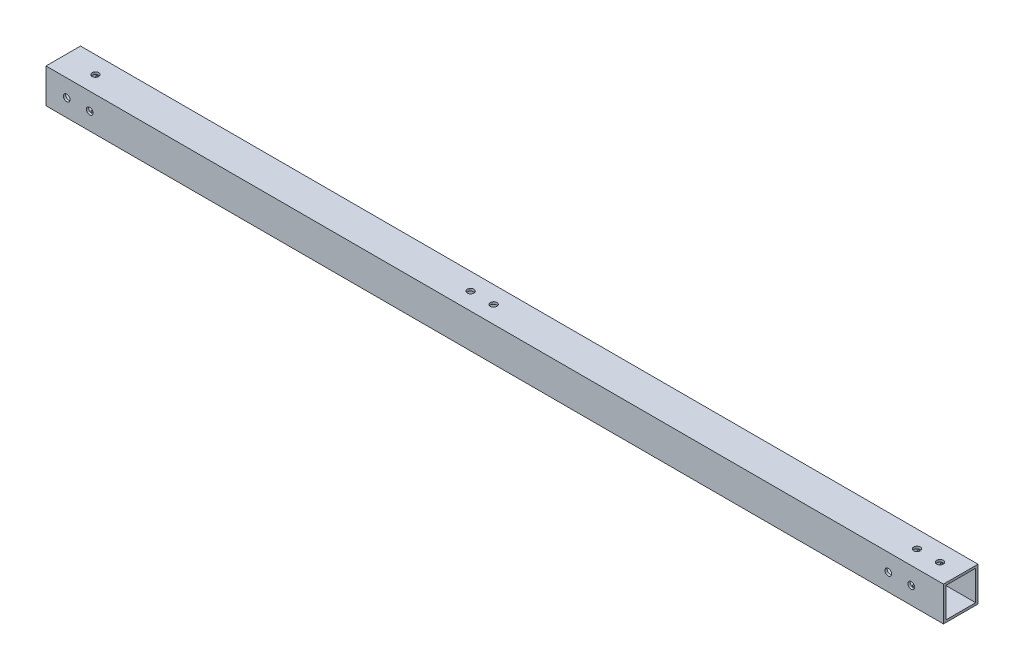
ISO-10303-21;
HEADER;
FILE_DESCRIPTION(('STEP AP214'),'2;1');
FILE_NAME('part.step','',(''),(''),'','','');
FILE_SCHEMA(('AUTOMOTIVE_DESIGN { 1 0 10303 214 1 1 1 1 }'));
ENDSEC;
DATA;
#1=APPLICATION_CONTEXT('core data for automotive mechanical design processes');
#2=APPLICATION_PROTOCOL_DEFINITION('international standard','automotive_design',2000,#1);
#3=PRODUCT_CONTEXT('',#1,'mechanical');
#4=PRODUCT('Part','Part','',(#3));
#5=PRODUCT_RELATED_PRODUCT_CATEGORY('part','',(#4));
#6=PRODUCT_DEFINITION_FORMATION('','',#4);
#7=PRODUCT_DEFINITION_CONTEXT('part definition',#1,'design');
#8=PRODUCT_DEFINITION('design','',#6,#7);
#9=PRODUCT_DEFINITION_SHAPE('','',#8);
#10=(LENGTH_UNIT() NAMED_UNIT(*) SI_UNIT(.MILLI.,.METRE.));
#11=(NAMED_UNIT(*) PLANE_ANGLE_UNIT() SI_UNIT($,.RADIAN.));
#12=(NAMED_UNIT(*) SI_UNIT($,.STERADIAN.) SOLID_ANGLE_UNIT());
#13=UNCERTAINTY_MEASURE_WITH_UNIT(LENGTH_MEASURE(1.E-05),#10,'distance_accuracy_value','');
#14=(GEOMETRIC_REPRESENTATION_CONTEXT(3) GLOBAL_UNCERTAINTY_ASSIGNED_CONTEXT((#13)) GLOBAL_UNIT_ASSIGNED_CONTEXT((#10,
#11,#12)) REPRESENTATION_CONTEXT('',''));
#15=CARTESIAN_POINT('',(0.,0.,0.));
#16=DIRECTION('',(0.,0.,1.));
#17=DIRECTION('',(1.,0.,0.));
#18=AXIS2_PLACEMENT_3D('',#15,#16,#17);
#19=CARTESIAN_POINT('',(390.,0.,0.));
#20=DIRECTION('',(-1.,0.,0.));
#21=DIRECTION('',(0.,0.,1.));
#22=AXIS2_PLACEMENT_3D('',#19,#20,#21);
#23=PLANE('',#22);
#24=DIRECTION('',(0.,1.,0.));
#25=VECTOR('',#24,1.);
#26=CARTESIAN_POINT('',(390.,-7.5,-7.5));
#27=LINE('',#26,#25);
#28=CARTESIAN_POINT('',(390.,-7.5,-7.5));
#29=VERTEX_POINT('',#28);
#30=CARTESIAN_POINT('',(390.,7.5,-7.5));
#31=VERTEX_POINT('',#30);
#32=EDGE_CURVE('E147',#29,#31,#27,.T.);
#33=ORIENTED_EDGE('',*,*,#32,.T.);
#34=DIRECTION('',(0.,0.,1.));
#35=VECTOR('',#34,1.);
#36=CARTESIAN_POINT('',(390.,7.5,7.5));
#37=LINE('',#36,#35);
#38=CARTESIAN_POINT('',(390.,7.5,7.5));
#39=VERTEX_POINT('',#38);
#40=EDGE_CURVE('E150',#31,#39,#37,.T.);
#41=ORIENTED_EDGE('',*,*,#40,.T.);
#42=DIRECTION('',(0.,-1.,0.));
#43=VECTOR('',#42,1.);
#44=CARTESIAN_POINT('',(390.,-7.5,7.5));
#45=LINE('',#44,#43);
#46=CARTESIAN_POINT('',(390.,-7.5,7.5));
#47=VERTEX_POINT('',#46);
#48=EDGE_CURVE('E153',#39,#47,#45,.T.);
#49=ORIENTED_EDGE('',*,*,#48,.T.);
#50=DIRECTION('',(0.,0.,-1.));
#51=VECTOR('',#50,1.);
#52=CARTESIAN_POINT('',(390.,-7.5,7.5));
#53=LINE('',#52,#51);
#54=EDGE_CURVE('E155',#47,#29,#53,.T.);
#55=ORIENTED_EDGE('',*,*,#54,.T.);
#56=EDGE_LOOP('',(#33,#41,#49,#55));
#57=FACE_BOUND('',#56,.T.);
#58=DIRECTION('',(0.,0.,-1.));
#59=VECTOR('',#58,1.);
#60=CARTESIAN_POINT('',(390.,-6.5,6.5));
#61=LINE('',#60,#59);
#62=CARTESIAN_POINT('',(390.,-6.5,6.5));
#63=VERTEX_POINT('',#62);
#64=CARTESIAN_POINT('',(390.,-6.5,-6.5));
#65=VERTEX_POINT('',#64);
#66=EDGE_CURVE('E109',#63,#65,#61,.T.);
#67=ORIENTED_EDGE('',*,*,#66,.F.);
#68=DIRECTION('',(0.,-1.,0.));
#69=VECTOR('',#68,1.);
#70=CARTESIAN_POINT('',(390.,-6.5,6.5));
#71=LINE('',#70,#69);
#72=CARTESIAN_POINT('',(390.,6.5,6.5));
#73=VERTEX_POINT('',#72);
#74=EDGE_CURVE('E131',#73,#63,#71,.T.);
#75=ORIENTED_EDGE('',*,*,#74,.F.);
#76=DIRECTION('',(0.,0.,1.));
#77=VECTOR('',#76,1.);
#78=CARTESIAN_POINT('',(390.,6.5,6.5));
#79=LINE('',#78,#77);
#80=CARTESIAN_POINT('',(390.,6.5,-6.5));
#81=VERTEX_POINT('',#80);
#82=EDGE_CURVE('E129',#81,#73,#79,.T.);
#83=ORIENTED_EDGE('',*,*,#82,.F.);
#84=DIRECTION('',(0.,1.,0.));
#85=VECTOR('',#84,1.);
#86=CARTESIAN_POINT('',(390.,-6.5,-6.5));
#87=LINE('',#86,#85);
#88=EDGE_CURVE('E117',#65,#81,#87,.T.);
#89=ORIENTED_EDGE('',*,*,#88,.F.);
#90=EDGE_LOOP('',(#67,#75,#83,#89));
#91=FACE_BOUND('',#90,.T.);
#92=ADVANCED_FACE('F42',(#57,#91),#23,.F.);
#93=CARTESIAN_POINT('',(0.,0.,0.));
#94=DIRECTION('',(-1.,0.,0.));
#95=DIRECTION('',(0.,0.,1.));
#96=AXIS2_PLACEMENT_3D('',#93,#94,#95);
#97=PLANE('',#96);
#98=DIRECTION('',(0.,1.,0.));
#99=VECTOR('',#98,1.);
#100=CARTESIAN_POINT('',(0.,-7.5,-7.5));
#101=LINE('',#100,#99);
#102=CARTESIAN_POINT('',(0.,-7.5,-7.5));
#103=VERTEX_POINT('',#102);
#104=CARTESIAN_POINT('',(0.,7.5,-7.5));
#105=VERTEX_POINT('',#104);
#106=EDGE_CURVE('E125',#103,#105,#101,.T.);
#107=ORIENTED_EDGE('',*,*,#106,.F.);
#108=DIRECTION('',(0.,0.,-1.));
#109=VECTOR('',#108,1.);
#110=CARTESIAN_POINT('',(0.,-7.5,7.5));
#111=LINE('',#110,#109);
#112=CARTESIAN_POINT('',(0.,-7.5,7.5));
#113=VERTEX_POINT('',#112);
#114=EDGE_CURVE('E151',#113,#103,#111,.T.);
#115=ORIENTED_EDGE('',*,*,#114,.F.);
#116=DIRECTION('',(0.,-1.,0.));
#117=VECTOR('',#116,1.);
#118=CARTESIAN_POINT('',(0.,-7.5,7.5));
#119=LINE('',#118,#117);
#120=CARTESIAN_POINT('',(0.,7.5,7.5));
#121=VERTEX_POINT('',#120);
#122=EDGE_CURVE('E162',#121,#113,#119,.T.);
#123=ORIENTED_EDGE('',*,*,#122,.F.);
#124=DIRECTION('',(0.,0.,1.));
#125=VECTOR('',#124,1.);
#126=CARTESIAN_POINT('',(0.,7.5,7.5));
#127=LINE('',#126,#125);
#128=EDGE_CURVE('E160',#105,#121,#127,.T.);
#129=ORIENTED_EDGE('',*,*,#128,.F.);
#130=EDGE_LOOP('',(#107,#115,#123,#129));
#131=FACE_BOUND('',#130,.T.);
#132=DIRECTION('',(0.,-1.,0.));
#133=VECTOR('',#132,1.);
#134=CARTESIAN_POINT('',(0.,-6.5,6.5));
#135=LINE('',#134,#133);
#136=CARTESIAN_POINT('',(0.,6.5,6.5));
#137=VERTEX_POINT('',#136);
#138=CARTESIAN_POINT('',(0.,-6.5,6.5));
#139=VERTEX_POINT('',#138);
#140=EDGE_CURVE('E118',#137,#139,#135,.T.);
#141=ORIENTED_EDGE('',*,*,#140,.T.);
#142=DIRECTION('',(0.,0.,-1.));
#143=VECTOR('',#142,1.);
#144=CARTESIAN_POINT('',(0.,-6.5,6.5));
#145=LINE('',#144,#143);
#146=CARTESIAN_POINT('',(0.,-6.5,-6.5));
#147=VERTEX_POINT('',#146);
#148=EDGE_CURVE('E67',#139,#147,#145,.T.);
#149=ORIENTED_EDGE('',*,*,#148,.T.);
#150=DIRECTION('',(0.,1.,0.));
#151=VECTOR('',#150,1.);
#152=CARTESIAN_POINT('',(0.,-6.5,-6.5));
#153=LINE('',#152,#151);
#154=CARTESIAN_POINT('',(0.,6.5,-6.5));
#155=VERTEX_POINT('',#154);
#156=EDGE_CURVE('E124',#147,#155,#153,.T.);
#157=ORIENTED_EDGE('',*,*,#156,.T.);
#158=DIRECTION('',(0.,0.,1.));
#159=VECTOR('',#158,1.);
#160=CARTESIAN_POINT('',(0.,6.5,6.5));
#161=LINE('',#160,#159);
#162=EDGE_CURVE('E139',#155,#137,#161,.T.);
#163=ORIENTED_EDGE('',*,*,#162,.T.);
#164=EDGE_LOOP('',(#141,#149,#157,#163));
#165=FACE_BOUND('',#164,.T.);
#166=ADVANCED_FACE('F273',(#131,#165),#97,.T.);
#167=CARTESIAN_POINT('',(390.,-7.5,-7.5));
#168=DIRECTION('',(0.,0.,1.));
#169=DIRECTION('',(1.,0.,0.));
#170=AXIS2_PLACEMENT_3D('',#167,#168,#169);
#171=PLANE('',#170);
#172=CARTESIAN_POINT('',(9.00000000000001,0.,-7.5));
#173=DIRECTION('',(0.,0.,-1.));
#174=DIRECTION('',(-1.,0.,0.));
#175=AXIS2_PLACEMENT_3D('',#172,#173,#174);
#176=CIRCLE('',#175,1.45);
#177=CARTESIAN_POINT('',(7.55000000000001,0.,-7.5));
#178=VERTEX_POINT('',#177);
#179=EDGE_CURVE('E231',#178,#178,#176,.T.);
#180=ORIENTED_EDGE('',*,*,#179,.F.);
#181=EDGE_LOOP('',(#180));
#182=FACE_BOUND('',#181,.T.);
#183=CARTESIAN_POINT('',(19.,0.,-7.5));
#184=DIRECTION('',(0.,0.,-1.));
#185=DIRECTION('',(-1.,0.,0.));
#186=AXIS2_PLACEMENT_3D('',#183,#184,#185);
#187=CIRCLE('',#186,1.45);
#188=CARTESIAN_POINT('',(17.55,0.,-7.5));
#189=VERTEX_POINT('',#188);
#190=EDGE_CURVE('E225',#189,#189,#187,.T.);
#191=ORIENTED_EDGE('',*,*,#190,.F.);
#192=EDGE_LOOP('',(#191));
#193=FACE_BOUND('',#192,.T.);
#194=CARTESIAN_POINT('',(376.,-2.00360561475321E-13,-7.5));
#195=DIRECTION('',(0.,0.,-1.));
#196=DIRECTION('',(-1.,0.,0.));
#197=AXIS2_PLACEMENT_3D('',#194,#195,#196);
#198=CIRCLE('',#197,1.45);
#199=CARTESIAN_POINT('',(374.55,-2.00360561475321E-13,-7.5));
#200=VERTEX_POINT('',#199);
#201=EDGE_CURVE('E218',#200,#200,#198,.T.);
#202=ORIENTED_EDGE('',*,*,#201,.F.);
#203=EDGE_LOOP('',(#202));
#204=FACE_BOUND('',#203,.T.);
#205=CARTESIAN_POINT('',(366.,-2.04697370165263E-13,-7.5));
#206=DIRECTION('',(0.,0.,-1.));
#207=DIRECTION('',(-1.,0.,0.));
#208=AXIS2_PLACEMENT_3D('',#205,#206,#207);
#209=CIRCLE('',#208,1.45);
#210=CARTESIAN_POINT('',(364.55,-2.04697370165263E-13,-7.5));
#211=VERTEX_POINT('',#210);
#212=EDGE_CURVE('E221',#211,#211,#209,.T.);
#213=ORIENTED_EDGE('',*,*,#212,.F.);
#214=EDGE_LOOP('',(#213));
#215=FACE_BOUND('',#214,.T.);
#216=ORIENTED_EDGE('',*,*,#106,.T.);
#217=DIRECTION('',(-1.,0.,0.));
#218=VECTOR('',#217,1.);
#219=CARTESIAN_POINT('',(390.,7.5,-7.5));
#220=LINE('',#219,#218);
#221=EDGE_CURVE('E11',#31,#105,#220,.T.);
#222=ORIENTED_EDGE('',*,*,#221,.F.);
#223=ORIENTED_EDGE('',*,*,#32,.F.);
#224=DIRECTION('',(-1.,0.,0.));
#225=VECTOR('',#224,1.);
#226=CARTESIAN_POINT('',(390.,-7.5,-7.5));
#227=LINE('',#226,#225);
#228=EDGE_CURVE('E157',#29,#103,#227,.T.);
#229=ORIENTED_EDGE('',*,*,#228,.T.);
#230=EDGE_LOOP('',(#216,#222,#223,#229));
#231=FACE_BOUND('',#230,.T.);
#232=ADVANCED_FACE('F44',(#182,#193,#204,#215,#231),#171,.F.);
#233=CARTESIAN_POINT('',(390.,7.5,7.5));
#234=DIRECTION('',(0.,-1.,0.));
#235=DIRECTION('',(0.,0.,-1.));
#236=AXIS2_PLACEMENT_3D('',#233,#234,#235);
#237=PLANE('',#236);
#238=CARTESIAN_POINT('',(381.,7.5,0.));
#239=DIRECTION('',(0.,1.,0.));
#240=DIRECTION('',(0.,0.,1.));
#241=AXIS2_PLACEMENT_3D('',#238,#239,#240);
#242=CIRCLE('',#241,1.45);
#243=CARTESIAN_POINT('',(381.,7.5,1.45000000000006));
#244=VERTEX_POINT('',#243);
#245=EDGE_CURVE('E385',#244,#244,#242,.T.);
#246=ORIENTED_EDGE('',*,*,#245,.F.);
#247=EDGE_LOOP('',(#246));
#248=FACE_BOUND('',#247,.T.);
#249=CARTESIAN_POINT('',(14.,7.5,0.));
#250=DIRECTION('',(0.,1.,0.));
#251=DIRECTION('',(0.,0.,1.));
#252=AXIS2_PLACEMENT_3D('',#249,#250,#251);
#253=CIRCLE('',#252,1.45);
#254=CARTESIAN_POINT('',(14.,7.5,1.45));
#255=VERTEX_POINT('',#254);
#256=EDGE_CURVE('E392',#255,#255,#253,.T.);
#257=ORIENTED_EDGE('',*,*,#256,.F.);
#258=EDGE_LOOP('',(#257));
#259=FACE_BOUND('',#258,.T.);
#260=CARTESIAN_POINT('',(177.,7.5,0.));
#261=DIRECTION('',(0.,1.,0.));
#262=DIRECTION('',(0.,0.,1.));
#263=AXIS2_PLACEMENT_3D('',#260,#261,#262);
#264=CIRCLE('',#263,1.45);
#265=CARTESIAN_POINT('',(177.,7.5,1.45));
#266=VERTEX_POINT('',#265);
#267=EDGE_CURVE('E373',#266,#266,#264,.T.);
#268=ORIENTED_EDGE('',*,*,#267,.F.);
#269=EDGE_LOOP('',(#268));
#270=FACE_BOUND('',#269,.T.);
#271=CARTESIAN_POINT('',(187.,7.5,0.));
#272=DIRECTION('',(0.,1.,0.));
#273=DIRECTION('',(0.,0.,1.));
#274=AXIS2_PLACEMENT_3D('',#271,#272,#273);
#275=CIRCLE('',#274,1.45);
#276=CARTESIAN_POINT('',(187.,7.5,1.45));
#277=VERTEX_POINT('',#276);
#278=EDGE_CURVE('E374',#277,#277,#275,.T.);
#279=ORIENTED_EDGE('',*,*,#278,.F.);
#280=EDGE_LOOP('',(#279));
#281=FACE_BOUND('',#280,.T.);
#282=CARTESIAN_POINT('',(371.,7.5,0.));
#283=DIRECTION('',(0.,1.,0.));
#284=DIRECTION('',(0.,0.,1.));
#285=AXIS2_PLACEMENT_3D('',#282,#283,#284);
#286=CIRCLE('',#285,1.45);
#287=CARTESIAN_POINT('',(371.,7.5,1.45000000000006));
#288=VERTEX_POINT('',#287);
#289=EDGE_CURVE('E388',#288,#288,#286,.T.);
#290=ORIENTED_EDGE('',*,*,#289,.F.);
#291=EDGE_LOOP('',(#290));
#292=FACE_BOUND('',#291,.T.);
#293=ORIENTED_EDGE('',*,*,#128,.T.);
#294=DIRECTION('',(-1.,0.,0.));
#295=VECTOR('',#294,1.);
#296=CARTESIAN_POINT('',(390.,7.5,7.5));
#297=LINE('',#296,#295);
#298=EDGE_CURVE('E51',#39,#121,#297,.T.);
#299=ORIENTED_EDGE('',*,*,#298,.F.);
#300=ORIENTED_EDGE('',*,*,#40,.F.);
#301=ORIENTED_EDGE('',*,*,#221,.T.);
#302=EDGE_LOOP('',(#293,#299,#300,#301));
#303=FACE_BOUND('',#302,.T.);
#304=ADVANCED_FACE('F272',(#248,#259,#270,#281,#292,#303),#237,.F.);
#305=CARTESIAN_POINT('',(390.,-7.5,7.5));
#306=DIRECTION('',(0.,0.,-1.));
#307=DIRECTION('',(-1.,0.,0.));
#308=AXIS2_PLACEMENT_3D('',#305,#306,#307);
#309=PLANE('',#308);
#310=CARTESIAN_POINT('',(9.00000000000001,0.,7.5));
#311=DIRECTION('',(0.,0.,-1.));
#312=DIRECTION('',(-1.,0.,0.));
#313=AXIS2_PLACEMENT_3D('',#310,#311,#312);
#314=CIRCLE('',#313,1.45);
#315=CARTESIAN_POINT('',(7.55000000000001,0.,7.5));
#316=VERTEX_POINT('',#315);
#317=EDGE_CURVE('E217',#316,#316,#314,.T.);
#318=ORIENTED_EDGE('',*,*,#317,.T.);
#319=EDGE_LOOP('',(#318));
#320=FACE_BOUND('',#319,.T.);
#321=CARTESIAN_POINT('',(19.,0.,7.5));
#322=DIRECTION('',(0.,0.,-1.));
#323=DIRECTION('',(-1.,0.,0.));
#324=AXIS2_PLACEMENT_3D('',#321,#322,#323);
#325=CIRCLE('',#324,1.45);
#326=CARTESIAN_POINT('',(17.55,0.,7.5));
#327=VERTEX_POINT('',#326);
#328=EDGE_CURVE('E228',#327,#327,#325,.T.);
#329=ORIENTED_EDGE('',*,*,#328,.T.);
#330=EDGE_LOOP('',(#329));
#331=FACE_BOUND('',#330,.T.);
#332=CARTESIAN_POINT('',(376.,-2.00360561475321E-13,7.5));
#333=DIRECTION('',(0.,0.,-1.));
#334=DIRECTION('',(-1.,0.,0.));
#335=AXIS2_PLACEMENT_3D('',#332,#333,#334);
#336=CIRCLE('',#335,1.45);
#337=CARTESIAN_POINT('',(374.55,-2.00360561475321E-13,7.5));
#338=VERTEX_POINT('',#337);
#339=EDGE_CURVE('E222',#338,#338,#336,.T.);
#340=ORIENTED_EDGE('',*,*,#339,.T.);
#341=EDGE_LOOP('',(#340));
#342=FACE_BOUND('',#341,.T.);
#343=CARTESIAN_POINT('',(366.,-2.04697370165263E-13,7.5));
#344=DIRECTION('',(0.,0.,-1.));
#345=DIRECTION('',(-1.,0.,0.));
#346=AXIS2_PLACEMENT_3D('',#343,#344,#345);
#347=CIRCLE('',#346,1.45);
#348=CARTESIAN_POINT('',(364.55,-2.04697370165263E-13,7.5));
#349=VERTEX_POINT('',#348);
#350=EDGE_CURVE('E176',#349,#349,#347,.T.);
#351=ORIENTED_EDGE('',*,*,#350,.T.);
#352=EDGE_LOOP('',(#351));
#353=FACE_BOUND('',#352,.T.);
#354=ORIENTED_EDGE('',*,*,#122,.T.);
#355=DIRECTION('',(-1.,0.,0.));
#356=VECTOR('',#355,1.);
#357=CARTESIAN_POINT('',(390.,-7.5,7.5));
#358=LINE('',#357,#356);
#359=EDGE_CURVE('E167',#47,#113,#358,.T.);
#360=ORIENTED_EDGE('',*,*,#359,.F.);
#361=ORIENTED_EDGE('',*,*,#48,.F.);
#362=ORIENTED_EDGE('',*,*,#298,.T.);
#363=EDGE_LOOP('',(#354,#360,#361,#362));
#364=FACE_BOUND('',#363,.T.);
#365=ADVANCED_FACE('F292',(#320,#331,#342,#353,#364),#309,.F.);
#366=CARTESIAN_POINT('',(390.,-7.5,7.5));
#367=DIRECTION('',(0.,1.,0.));
#368=DIRECTION('',(0.,0.,1.));
#369=AXIS2_PLACEMENT_3D('',#366,#367,#368);
#370=PLANE('',#369);
#371=CARTESIAN_POINT('',(381.,-7.5,0.));
#372=DIRECTION('',(0.,1.,0.));
#373=DIRECTION('',(0.,0.,1.));
#374=AXIS2_PLACEMENT_3D('',#371,#372,#373);
#375=CIRCLE('',#374,1.45);
#376=CARTESIAN_POINT('',(381.,-7.5,1.45000000000006));
#377=VERTEX_POINT('',#376);
#378=EDGE_CURVE('E389',#377,#377,#375,.T.);
#379=ORIENTED_EDGE('',*,*,#378,.T.);
#380=EDGE_LOOP('',(#379));
#381=FACE_BOUND('',#380,.T.);
#382=CARTESIAN_POINT('',(14.,-7.5,0.));
#383=DIRECTION('',(0.,1.,0.));
#384=DIRECTION('',(0.,0.,1.));
#385=AXIS2_PLACEMENT_3D('',#382,#383,#384);
#386=CIRCLE('',#385,1.45);
#387=CARTESIAN_POINT('',(14.,-7.5,1.45));
#388=VERTEX_POINT('',#387);
#389=EDGE_CURVE('E377',#388,#388,#386,.T.);
#390=ORIENTED_EDGE('',*,*,#389,.T.);
#391=EDGE_LOOP('',(#390));
#392=FACE_BOUND('',#391,.T.);
#393=CARTESIAN_POINT('',(177.,-7.5,0.));
#394=DIRECTION('',(0.,1.,0.));
#395=DIRECTION('',(0.,0.,1.));
#396=AXIS2_PLACEMENT_3D('',#393,#394,#395);
#397=CIRCLE('',#396,1.45);
#398=CARTESIAN_POINT('',(177.,-7.5,1.45));
#399=VERTEX_POINT('',#398);
#400=EDGE_CURVE('E371',#399,#399,#397,.T.);
#401=ORIENTED_EDGE('',*,*,#400,.T.);
#402=EDGE_LOOP('',(#401));
#403=FACE_BOUND('',#402,.T.);
#404=CARTESIAN_POINT('',(187.,-7.5,0.));
#405=DIRECTION('',(0.,1.,0.));
#406=DIRECTION('',(0.,0.,1.));
#407=AXIS2_PLACEMENT_3D('',#404,#405,#406);
#408=CIRCLE('',#407,1.45);
#409=CARTESIAN_POINT('',(187.,-7.5,1.45));
#410=VERTEX_POINT('',#409);
#411=EDGE_CURVE('E380',#410,#410,#408,.T.);
#412=ORIENTED_EDGE('',*,*,#411,.T.);
#413=EDGE_LOOP('',(#412));
#414=FACE_BOUND('',#413,.T.);
#415=CARTESIAN_POINT('',(371.,-7.5,0.));
#416=DIRECTION('',(0.,1.,0.));
#417=DIRECTION('',(0.,0.,1.));
#418=AXIS2_PLACEMENT_3D('',#415,#416,#417);
#419=CIRCLE('',#418,1.45);
#420=CARTESIAN_POINT('',(371.,-7.5,1.45000000000006));
#421=VERTEX_POINT('',#420);
#422=EDGE_CURVE('E192',#421,#421,#419,.T.);
#423=ORIENTED_EDGE('',*,*,#422,.T.);
#424=EDGE_LOOP('',(#423));
#425=FACE_BOUND('',#424,.T.);
#426=ORIENTED_EDGE('',*,*,#114,.T.);
#427=ORIENTED_EDGE('',*,*,#228,.F.);
#428=ORIENTED_EDGE('',*,*,#54,.F.);
#429=ORIENTED_EDGE('',*,*,#359,.T.);
#430=EDGE_LOOP('',(#426,#427,#428,#429));
#431=FACE_BOUND('',#430,.T.);
#432=ADVANCED_FACE('F290',(#381,#392,#403,#414,#425,#431),#370,.F.);
#433=CARTESIAN_POINT('',(390.,-6.5,6.5));
#434=DIRECTION('',(0.,1.,0.));
#435=DIRECTION('',(0.,0.,1.));
#436=AXIS2_PLACEMENT_3D('',#433,#434,#435);
#437=PLANE('',#436);
#438=CARTESIAN_POINT('',(381.,-6.5,0.));
#439=DIRECTION('',(0.,1.,0.));
#440=DIRECTION('',(0.,0.,1.));
#441=AXIS2_PLACEMENT_3D('',#438,#439,#440);
#442=CIRCLE('',#441,1.45);
#443=CARTESIAN_POINT('',(381.,-6.5,1.45000000000006));
#444=VERTEX_POINT('',#443);
#445=EDGE_CURVE('E214',#444,#444,#442,.T.);
#446=ORIENTED_EDGE('',*,*,#445,.F.);
#447=EDGE_LOOP('',(#446));
#448=FACE_BOUND('',#447,.T.);
#449=CARTESIAN_POINT('',(14.,-6.5,0.));
#450=DIRECTION('',(0.,1.,0.));
#451=DIRECTION('',(0.,0.,1.));
#452=AXIS2_PLACEMENT_3D('',#449,#450,#451);
#453=CIRCLE('',#452,1.45);
#454=CARTESIAN_POINT('',(14.,-6.5,1.45));
#455=VERTEX_POINT('',#454);
#456=EDGE_CURVE('E202',#455,#455,#453,.T.);
#457=ORIENTED_EDGE('',*,*,#456,.F.);
#458=EDGE_LOOP('',(#457));
#459=FACE_BOUND('',#458,.T.);
#460=CARTESIAN_POINT('',(177.,-6.5,0.));
#461=DIRECTION('',(0.,1.,0.));
#462=DIRECTION('',(0.,0.,1.));
#463=AXIS2_PLACEMENT_3D('',#460,#461,#462);
#464=CIRCLE('',#463,1.45);
#465=CARTESIAN_POINT('',(177.,-6.5,1.45));
#466=VERTEX_POINT('',#465);
#467=EDGE_CURVE('E199',#466,#466,#464,.T.);
#468=ORIENTED_EDGE('',*,*,#467,.F.);
#469=EDGE_LOOP('',(#468));
#470=FACE_BOUND('',#469,.T.);
#471=CARTESIAN_POINT('',(187.,-6.5,0.));
#472=DIRECTION('',(0.,1.,0.));
#473=DIRECTION('',(0.,0.,1.));
#474=AXIS2_PLACEMENT_3D('',#471,#472,#473);
#475=CIRCLE('',#474,1.45);
#476=CARTESIAN_POINT('',(187.,-6.5,1.45));
#477=VERTEX_POINT('',#476);
#478=EDGE_CURVE('E196',#477,#477,#475,.T.);
#479=ORIENTED_EDGE('',*,*,#478,.F.);
#480=EDGE_LOOP('',(#479));
#481=FACE_BOUND('',#480,.T.);
#482=CARTESIAN_POINT('',(371.,-6.5,0.));
#483=DIRECTION('',(0.,1.,0.));
#484=DIRECTION('',(0.,0.,1.));
#485=AXIS2_PLACEMENT_3D('',#482,#483,#484);
#486=CIRCLE('',#485,1.45);
#487=CARTESIAN_POINT('',(371.,-6.5,1.45000000000006));
#488=VERTEX_POINT('',#487);
#489=EDGE_CURVE('E191',#488,#488,#486,.T.);
#490=ORIENTED_EDGE('',*,*,#489,.F.);
#491=EDGE_LOOP('',(#490));
#492=FACE_BOUND('',#491,.T.);
#493=ORIENTED_EDGE('',*,*,#148,.F.);
#494=DIRECTION('',(-1.,0.,0.));
#495=VECTOR('',#494,1.);
#496=CARTESIAN_POINT('',(390.,-6.5,6.5));
#497=LINE('',#496,#495);
#498=EDGE_CURVE('E113',#63,#139,#497,.T.);
#499=ORIENTED_EDGE('',*,*,#498,.F.);
#500=ORIENTED_EDGE('',*,*,#66,.T.);
#501=DIRECTION('',(-1.,0.,0.));
#502=VECTOR('',#501,1.);
#503=CARTESIAN_POINT('',(390.,-6.5,-6.5));
#504=LINE('',#503,#502);
#505=EDGE_CURVE('E112',#65,#147,#504,.T.);
#506=ORIENTED_EDGE('',*,*,#505,.T.);
#507=EDGE_LOOP('',(#493,#499,#500,#506));
#508=FACE_BOUND('',#507,.T.);
#509=ADVANCED_FACE('F111',(#448,#459,#470,#481,#492,#508),#437,.T.);
#510=CARTESIAN_POINT('',(390.,-6.5,-6.5));
#511=DIRECTION('',(0.,0.,1.));
#512=DIRECTION('',(0.,-1.,0.));
#513=AXIS2_PLACEMENT_3D('',#510,#511,#512);
#514=PLANE('',#513);
#515=CARTESIAN_POINT('',(9.00000000000001,0.,-6.5));
#516=DIRECTION('',(0.,0.,1.));
#517=DIRECTION('',(0.,-1.,0.));
#518=AXIS2_PLACEMENT_3D('',#515,#516,#517);
#519=CIRCLE('',#518,1.45);
#520=CARTESIAN_POINT('',(9.00000000000001,-1.45,-6.5));
#521=VERTEX_POINT('',#520);
#522=EDGE_CURVE('E137',#521,#521,#519,.T.);
#523=ORIENTED_EDGE('',*,*,#522,.F.);
#524=EDGE_LOOP('',(#523));
#525=FACE_BOUND('',#524,.T.);
#526=CARTESIAN_POINT('',(19.,0.,-6.5));
#527=DIRECTION('',(0.,0.,1.));
#528=DIRECTION('',(0.,-1.,0.));
#529=AXIS2_PLACEMENT_3D('',#526,#527,#528);
#530=CIRCLE('',#529,1.45);
#531=CARTESIAN_POINT('',(19.,-1.45,-6.5));
#532=VERTEX_POINT('',#531);
#533=EDGE_CURVE('E184',#532,#532,#530,.T.);
#534=ORIENTED_EDGE('',*,*,#533,.F.);
#535=EDGE_LOOP('',(#534));
#536=FACE_BOUND('',#535,.T.);
#537=CARTESIAN_POINT('',(376.,-2.00360561475321E-13,-6.5));
#538=DIRECTION('',(0.,0.,1.));
#539=DIRECTION('',(0.,-1.,0.));
#540=AXIS2_PLACEMENT_3D('',#537,#538,#539);
#541=CIRCLE('',#540,1.45);
#542=CARTESIAN_POINT('',(376.,-1.4500000000002,-6.5));
#543=VERTEX_POINT('',#542);
#544=EDGE_CURVE('E180',#543,#543,#541,.T.);
#545=ORIENTED_EDGE('',*,*,#544,.F.);
#546=EDGE_LOOP('',(#545));
#547=FACE_BOUND('',#546,.T.);
#548=CARTESIAN_POINT('',(366.,-2.04697370165263E-13,-6.5));
#549=DIRECTION('',(0.,0.,1.));
#550=DIRECTION('',(0.,-1.,0.));
#551=AXIS2_PLACEMENT_3D('',#548,#549,#550);
#552=CIRCLE('',#551,1.45);
#553=CARTESIAN_POINT('',(366.,-1.4500000000002,-6.5));
#554=VERTEX_POINT('',#553);
#555=EDGE_CURVE('E175',#554,#554,#552,.T.);
#556=ORIENTED_EDGE('',*,*,#555,.F.);
#557=EDGE_LOOP('',(#556));
#558=FACE_BOUND('',#557,.T.);
#559=ORIENTED_EDGE('',*,*,#156,.F.);
#560=ORIENTED_EDGE('',*,*,#505,.F.);
#561=ORIENTED_EDGE('',*,*,#88,.T.);
#562=DIRECTION('',(-1.,0.,0.));
#563=VECTOR('',#562,1.);
#564=CARTESIAN_POINT('',(390.,6.5,-6.5));
#565=LINE('',#564,#563);
#566=EDGE_CURVE('E126',#81,#155,#565,.T.);
#567=ORIENTED_EDGE('',*,*,#566,.T.);
#568=EDGE_LOOP('',(#559,#560,#561,#567));
#569=FACE_BOUND('',#568,.T.);
#570=ADVANCED_FACE('F121',(#525,#536,#547,#558,#569),#514,.T.);
#571=CARTESIAN_POINT('',(390.,6.5,6.5));
#572=DIRECTION('',(0.,-1.,0.));
#573=DIRECTION('',(0.,0.,-1.));
#574=AXIS2_PLACEMENT_3D('',#571,#572,#573);
#575=PLANE('',#574);
#576=CARTESIAN_POINT('',(381.,6.5,0.));
#577=DIRECTION('',(0.,-1.,0.));
#578=DIRECTION('',(0.,0.,-1.));
#579=AXIS2_PLACEMENT_3D('',#576,#577,#578);
#580=CIRCLE('',#579,1.45);
#581=CARTESIAN_POINT('',(381.,6.5,-1.44999999999994));
#582=VERTEX_POINT('',#581);
#583=EDGE_CURVE('E46',#582,#582,#580,.T.);
#584=ORIENTED_EDGE('',*,*,#583,.F.);
#585=EDGE_LOOP('',(#584));
#586=FACE_BOUND('',#585,.T.);
#587=CARTESIAN_POINT('',(14.,6.5,0.));
#588=DIRECTION('',(0.,-1.,0.));
#589=DIRECTION('',(0.,0.,-1.));
#590=AXIS2_PLACEMENT_3D('',#587,#588,#589);
#591=CIRCLE('',#590,1.45);
#592=CARTESIAN_POINT('',(14.,6.5,-1.45));
#593=VERTEX_POINT('',#592);
#594=EDGE_CURVE('E200',#593,#593,#591,.T.);
#595=ORIENTED_EDGE('',*,*,#594,.F.);
#596=EDGE_LOOP('',(#595));
#597=FACE_BOUND('',#596,.T.);
#598=CARTESIAN_POINT('',(177.,6.5,0.));
#599=DIRECTION('',(0.,-1.,0.));
#600=DIRECTION('',(0.,0.,-1.));
#601=AXIS2_PLACEMENT_3D('',#598,#599,#600);
#602=CIRCLE('',#601,1.45);
#603=CARTESIAN_POINT('',(177.,6.5,-1.45));
#604=VERTEX_POINT('',#603);
#605=EDGE_CURVE('E197',#604,#604,#602,.T.);
#606=ORIENTED_EDGE('',*,*,#605,.F.);
#607=EDGE_LOOP('',(#606));
#608=FACE_BOUND('',#607,.T.);
#609=CARTESIAN_POINT('',(187.,6.5,0.));
#610=DIRECTION('',(0.,-1.,0.));
#611=DIRECTION('',(0.,0.,-1.));
#612=AXIS2_PLACEMENT_3D('',#609,#610,#611);
#613=CIRCLE('',#612,1.45);
#614=CARTESIAN_POINT('',(187.,6.5,-1.45));
#615=VERTEX_POINT('',#614);
#616=EDGE_CURVE('E193',#615,#615,#613,.T.);
#617=ORIENTED_EDGE('',*,*,#616,.F.);
#618=EDGE_LOOP('',(#617));
#619=FACE_BOUND('',#618,.T.);
#620=CARTESIAN_POINT('',(371.,6.5,0.));
#621=DIRECTION('',(0.,-1.,0.));
#622=DIRECTION('',(0.,0.,-1.));
#623=AXIS2_PLACEMENT_3D('',#620,#621,#622);
#624=CIRCLE('',#623,1.45);
#625=CARTESIAN_POINT('',(371.,6.5,-1.44999999999994));
#626=VERTEX_POINT('',#625);
#627=EDGE_CURVE('E188',#626,#626,#624,.T.);
#628=ORIENTED_EDGE('',*,*,#627,.F.);
#629=EDGE_LOOP('',(#628));
#630=FACE_BOUND('',#629,.T.);
#631=ORIENTED_EDGE('',*,*,#162,.F.);
#632=ORIENTED_EDGE('',*,*,#566,.F.);
#633=ORIENTED_EDGE('',*,*,#82,.T.);
#634=DIRECTION('',(-1.,0.,0.));
#635=VECTOR('',#634,1.);
#636=CARTESIAN_POINT('',(390.,6.5,6.5));
#637=LINE('',#636,#635);
#638=EDGE_CURVE('E59',#73,#137,#637,.T.);
#639=ORIENTED_EDGE('',*,*,#638,.T.);
#640=EDGE_LOOP('',(#631,#632,#633,#639));
#641=FACE_BOUND('',#640,.T.);
#642=ADVANCED_FACE('F253',(#586,#597,#608,#619,#630,#641),#575,.T.);
#643=CARTESIAN_POINT('',(390.,-6.5,6.5));
#644=DIRECTION('',(0.,0.,-1.));
#645=DIRECTION('',(-1.,0.,0.));
#646=AXIS2_PLACEMENT_3D('',#643,#644,#645);
#647=PLANE('',#646);
#648=CARTESIAN_POINT('',(9.00000000000001,0.,6.5));
#649=DIRECTION('',(0.,0.,-1.));
#650=DIRECTION('',(-1.,0.,0.));
#651=AXIS2_PLACEMENT_3D('',#648,#649,#650);
#652=CIRCLE('',#651,1.45);
#653=CARTESIAN_POINT('',(7.55000000000001,0.,6.5));
#654=VERTEX_POINT('',#653);
#655=EDGE_CURVE('E185',#654,#654,#652,.T.);
#656=ORIENTED_EDGE('',*,*,#655,.F.);
#657=EDGE_LOOP('',(#656));
#658=FACE_BOUND('',#657,.T.);
#659=CARTESIAN_POINT('',(19.,0.,6.5));
#660=DIRECTION('',(0.,0.,-1.));
#661=DIRECTION('',(-1.,0.,0.));
#662=AXIS2_PLACEMENT_3D('',#659,#660,#661);
#663=CIRCLE('',#662,1.45);
#664=CARTESIAN_POINT('',(17.55,0.,6.5));
#665=VERTEX_POINT('',#664);
#666=EDGE_CURVE('E181',#665,#665,#663,.T.);
#667=ORIENTED_EDGE('',*,*,#666,.F.);
#668=EDGE_LOOP('',(#667));
#669=FACE_BOUND('',#668,.T.);
#670=CARTESIAN_POINT('',(376.,-2.00360561475321E-13,6.5));
#671=DIRECTION('',(0.,0.,-1.));
#672=DIRECTION('',(-1.,0.,0.));
#673=AXIS2_PLACEMENT_3D('',#670,#671,#672);
#674=CIRCLE('',#673,1.45);
#675=CARTESIAN_POINT('',(374.55,-2.00360561475321E-13,6.5));
#676=VERTEX_POINT('',#675);
#677=EDGE_CURVE('E177',#676,#676,#674,.T.);
#678=ORIENTED_EDGE('',*,*,#677,.F.);
#679=EDGE_LOOP('',(#678));
#680=FACE_BOUND('',#679,.T.);
#681=CARTESIAN_POINT('',(366.,-2.04697370165263E-13,6.5));
#682=DIRECTION('',(0.,0.,-1.));
#683=DIRECTION('',(-1.,0.,0.));
#684=AXIS2_PLACEMENT_3D('',#681,#682,#683);
#685=CIRCLE('',#684,1.45);
#686=CARTESIAN_POINT('',(364.55,-2.04697370165263E-13,6.5));
#687=VERTEX_POINT('',#686);
#688=EDGE_CURVE('E172',#687,#687,#685,.T.);
#689=ORIENTED_EDGE('',*,*,#688,.F.);
#690=EDGE_LOOP('',(#689));
#691=FACE_BOUND('',#690,.T.);
#692=ORIENTED_EDGE('',*,*,#140,.F.);
#693=ORIENTED_EDGE('',*,*,#638,.F.);
#694=ORIENTED_EDGE('',*,*,#74,.T.);
#695=ORIENTED_EDGE('',*,*,#498,.T.);
#696=EDGE_LOOP('',(#692,#693,#694,#695));
#697=FACE_BOUND('',#696,.T.);
#698=ADVANCED_FACE('F316',(#658,#669,#680,#691,#697),#647,.T.);
#699=CARTESIAN_POINT('',(366.,-2.04697370165263E-13,7.5));
#700=DIRECTION('',(0.,0.,-1.));
#701=DIRECTION('',(-1.,0.,0.));
#702=AXIS2_PLACEMENT_3D('',#699,#700,#701);
#703=CYLINDRICAL_SURFACE('',#702,1.45);
#704=ORIENTED_EDGE('',*,*,#688,.T.);
#705=EDGE_LOOP('',(#704));
#706=FACE_BOUND('',#705,.T.);
#707=ORIENTED_EDGE('',*,*,#350,.F.);
#708=EDGE_LOOP('',(#707));
#709=FACE_BOUND('',#708,.T.);
#710=ADVANCED_FACE('F267',(#706,#709),#703,.F.);
#711=CARTESIAN_POINT('',(376.,-2.00360561475321E-13,7.5));
#712=DIRECTION('',(0.,0.,-1.));
#713=DIRECTION('',(-1.,0.,0.));
#714=AXIS2_PLACEMENT_3D('',#711,#712,#713);
#715=CYLINDRICAL_SURFACE('',#714,1.45);
#716=ORIENTED_EDGE('',*,*,#677,.T.);
#717=EDGE_LOOP('',(#716));
#718=FACE_BOUND('',#717,.T.);
#719=ORIENTED_EDGE('',*,*,#339,.F.);
#720=EDGE_LOOP('',(#719));
#721=FACE_BOUND('',#720,.T.);
#722=ADVANCED_FACE('F322',(#718,#721),#715,.F.);
#723=CARTESIAN_POINT('',(19.,0.,7.5));
#724=DIRECTION('',(0.,0.,-1.));
#725=DIRECTION('',(-1.,0.,0.));
#726=AXIS2_PLACEMENT_3D('',#723,#724,#725);
#727=CYLINDRICAL_SURFACE('',#726,1.45);
#728=ORIENTED_EDGE('',*,*,#666,.T.);
#729=EDGE_LOOP('',(#728));
#730=FACE_BOUND('',#729,.T.);
#731=ORIENTED_EDGE('',*,*,#328,.F.);
#732=EDGE_LOOP('',(#731));
#733=FACE_BOUND('',#732,.T.);
#734=ADVANCED_FACE('F326',(#730,#733),#727,.F.);
#735=CARTESIAN_POINT('',(9.00000000000001,0.,7.5));
#736=DIRECTION('',(0.,0.,-1.));
#737=DIRECTION('',(-1.,0.,0.));
#738=AXIS2_PLACEMENT_3D('',#735,#736,#737);
#739=CYLINDRICAL_SURFACE('',#738,1.45);
#740=ORIENTED_EDGE('',*,*,#655,.T.);
#741=EDGE_LOOP('',(#740));
#742=FACE_BOUND('',#741,.T.);
#743=ORIENTED_EDGE('',*,*,#317,.F.);
#744=EDGE_LOOP('',(#743));
#745=FACE_BOUND('',#744,.T.);
#746=ADVANCED_FACE('F265',(#742,#745),#739,.F.);
#747=ORIENTED_EDGE('',*,*,#555,.T.);
#748=EDGE_LOOP('',(#747));
#749=FACE_BOUND('',#748,.T.);
#750=ORIENTED_EDGE('',*,*,#212,.T.);
#751=EDGE_LOOP('',(#750));
#752=FACE_BOUND('',#751,.T.);
#753=ADVANCED_FACE('F261',(#749,#752),#703,.F.);
#754=ORIENTED_EDGE('',*,*,#544,.T.);
#755=EDGE_LOOP('',(#754));
#756=FACE_BOUND('',#755,.T.);
#757=ORIENTED_EDGE('',*,*,#201,.T.);
#758=EDGE_LOOP('',(#757));
#759=FACE_BOUND('',#758,.T.);
#760=ADVANCED_FACE('F264',(#756,#759),#715,.F.);
#761=ORIENTED_EDGE('',*,*,#533,.T.);
#762=EDGE_LOOP('',(#761));
#763=FACE_BOUND('',#762,.T.);
#764=ORIENTED_EDGE('',*,*,#190,.T.);
#765=EDGE_LOOP('',(#764));
#766=FACE_BOUND('',#765,.T.);
#767=ADVANCED_FACE('F331',(#763,#766),#727,.F.);
#768=ORIENTED_EDGE('',*,*,#522,.T.);
#769=EDGE_LOOP('',(#768));
#770=FACE_BOUND('',#769,.T.);
#771=ORIENTED_EDGE('',*,*,#179,.T.);
#772=EDGE_LOOP('',(#771));
#773=FACE_BOUND('',#772,.T.);
#774=ADVANCED_FACE('F248',(#770,#773),#739,.F.);
#775=CARTESIAN_POINT('',(371.,-7.5,0.));
#776=DIRECTION('',(0.,1.,0.));
#777=DIRECTION('',(0.,0.,1.));
#778=AXIS2_PLACEMENT_3D('',#775,#776,#777);
#779=CYLINDRICAL_SURFACE('',#778,1.45);
#780=ORIENTED_EDGE('',*,*,#627,.T.);
#781=EDGE_LOOP('',(#780));
#782=FACE_BOUND('',#781,.T.);
#783=ORIENTED_EDGE('',*,*,#289,.T.);
#784=EDGE_LOOP('',(#783));
#785=FACE_BOUND('',#784,.T.);
#786=ADVANCED_FACE('F335',(#782,#785),#779,.F.);
#787=CARTESIAN_POINT('',(187.,-7.5,0.));
#788=DIRECTION('',(0.,1.,0.));
#789=DIRECTION('',(0.,0.,1.));
#790=AXIS2_PLACEMENT_3D('',#787,#788,#789);
#791=CYLINDRICAL_SURFACE('',#790,1.45);
#792=ORIENTED_EDGE('',*,*,#616,.T.);
#793=EDGE_LOOP('',(#792));
#794=FACE_BOUND('',#793,.T.);
#795=ORIENTED_EDGE('',*,*,#278,.T.);
#796=EDGE_LOOP('',(#795));
#797=FACE_BOUND('',#796,.T.);
#798=ADVANCED_FACE('F338',(#794,#797),#791,.F.);
#799=CARTESIAN_POINT('',(177.,-7.5,0.));
#800=DIRECTION('',(0.,1.,0.));
#801=DIRECTION('',(0.,0.,1.));
#802=AXIS2_PLACEMENT_3D('',#799,#800,#801);
#803=CYLINDRICAL_SURFACE('',#802,1.45);
#804=ORIENTED_EDGE('',*,*,#605,.T.);
#805=EDGE_LOOP('',(#804));
#806=FACE_BOUND('',#805,.T.);
#807=ORIENTED_EDGE('',*,*,#267,.T.);
#808=EDGE_LOOP('',(#807));
#809=FACE_BOUND('',#808,.T.);
#810=ADVANCED_FACE('F345',(#806,#809),#803,.F.);
#811=CARTESIAN_POINT('',(14.,-7.5,0.));
#812=DIRECTION('',(0.,1.,0.));
#813=DIRECTION('',(0.,0.,1.));
#814=AXIS2_PLACEMENT_3D('',#811,#812,#813);
#815=CYLINDRICAL_SURFACE('',#814,1.45);
#816=ORIENTED_EDGE('',*,*,#594,.T.);
#817=EDGE_LOOP('',(#816));
#818=FACE_BOUND('',#817,.T.);
#819=ORIENTED_EDGE('',*,*,#256,.T.);
#820=EDGE_LOOP('',(#819));
#821=FACE_BOUND('',#820,.T.);
#822=ADVANCED_FACE('F341',(#818,#821),#815,.F.);
#823=CARTESIAN_POINT('',(381.,-7.5,0.));
#824=DIRECTION('',(0.,1.,0.));
#825=DIRECTION('',(0.,0.,1.));
#826=AXIS2_PLACEMENT_3D('',#823,#824,#825);
#827=CYLINDRICAL_SURFACE('',#826,1.45);
#828=ORIENTED_EDGE('',*,*,#583,.T.);
#829=EDGE_LOOP('',(#828));
#830=FACE_BOUND('',#829,.T.);
#831=ORIENTED_EDGE('',*,*,#245,.T.);
#832=EDGE_LOOP('',(#831));
#833=FACE_BOUND('',#832,.T.);
#834=ADVANCED_FACE('F344',(#830,#833),#827,.F.);
#835=ORIENTED_EDGE('',*,*,#489,.T.);
#836=EDGE_LOOP('',(#835));
#837=FACE_BOUND('',#836,.T.);
#838=ORIENTED_EDGE('',*,*,#422,.F.);
#839=EDGE_LOOP('',(#838));
#840=FACE_BOUND('',#839,.T.);
#841=ADVANCED_FACE('F340',(#837,#840),#779,.F.);
#842=ORIENTED_EDGE('',*,*,#478,.T.);
#843=EDGE_LOOP('',(#842));
#844=FACE_BOUND('',#843,.T.);
#845=ORIENTED_EDGE('',*,*,#411,.F.);
#846=EDGE_LOOP('',(#845));
#847=FACE_BOUND('',#846,.T.);
#848=ADVANCED_FACE('F354',(#844,#847),#791,.F.);
#849=ORIENTED_EDGE('',*,*,#467,.T.);
#850=EDGE_LOOP('',(#849));
#851=FACE_BOUND('',#850,.T.);
#852=ORIENTED_EDGE('',*,*,#400,.F.);
#853=EDGE_LOOP('',(#852));
#854=FACE_BOUND('',#853,.T.);
#855=ADVANCED_FACE('F357',(#851,#854),#803,.F.);
#856=ORIENTED_EDGE('',*,*,#456,.T.);
#857=EDGE_LOOP('',(#856));
#858=FACE_BOUND('',#857,.T.);
#859=ORIENTED_EDGE('',*,*,#389,.F.);
#860=EDGE_LOOP('',(#859));
#861=FACE_BOUND('',#860,.T.);
#862=ADVANCED_FACE('F346',(#858,#861),#815,.F.);
#863=ORIENTED_EDGE('',*,*,#445,.T.);
#864=EDGE_LOOP('',(#863));
#865=FACE_BOUND('',#864,.T.);
#866=ORIENTED_EDGE('',*,*,#378,.F.);
#867=EDGE_LOOP('',(#866));
#868=FACE_BOUND('',#867,.T.);
#869=ADVANCED_FACE('F350',(#865,#868),#827,.F.);
#870=CLOSED_SHELL('',(#92,#166,#232,#304,#365,#432,#509,#570,#642,#698,#710,#722,#734,#746,#753,
#760,#767,#774,#786,#798,#810,#822,#834,#841,#848,#855,#862,#869));
#871=MANIFOLD_SOLID_BREP('B2',#870);
#872=ADVANCED_BREP_SHAPE_REPRESENTATION('',(#18,#871),#14);
#873=SHAPE_DEFINITION_REPRESENTATION(#9,#872);
ENDSEC;
END-ISO-10303-21;
